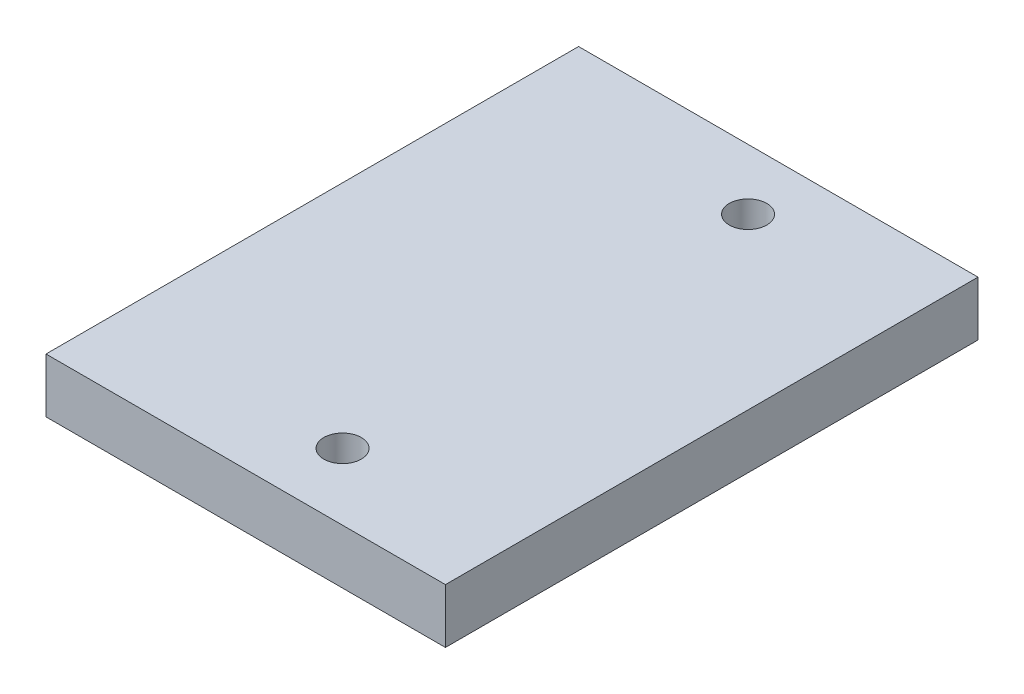
ISO-10303-21;
HEADER;
FILE_DESCRIPTION(('STEP AP214'),'2;1');
FILE_NAME('part.step','',(''),(''),'','','');
FILE_SCHEMA(('AUTOMOTIVE_DESIGN { 1 0 10303 214 1 1 1 1 }'));
ENDSEC;
DATA;
#1=APPLICATION_CONTEXT('core data for automotive mechanical design processes');
#2=APPLICATION_PROTOCOL_DEFINITION('international standard','automotive_design',2000,#1);
#3=PRODUCT_CONTEXT('',#1,'mechanical');
#4=PRODUCT('Part','Part','',(#3));
#5=PRODUCT_RELATED_PRODUCT_CATEGORY('part','',(#4));
#6=PRODUCT_DEFINITION_FORMATION('','',#4);
#7=PRODUCT_DEFINITION_CONTEXT('part definition',#1,'design');
#8=PRODUCT_DEFINITION('design','',#6,#7);
#9=PRODUCT_DEFINITION_SHAPE('','',#8);
#10=(LENGTH_UNIT() NAMED_UNIT(*) SI_UNIT(.MILLI.,.METRE.));
#11=(NAMED_UNIT(*) PLANE_ANGLE_UNIT() SI_UNIT($,.RADIAN.));
#12=(NAMED_UNIT(*) SI_UNIT($,.STERADIAN.) SOLID_ANGLE_UNIT());
#13=UNCERTAINTY_MEASURE_WITH_UNIT(LENGTH_MEASURE(1.E-05),#10,'distance_accuracy_value','');
#14=(GEOMETRIC_REPRESENTATION_CONTEXT(3) GLOBAL_UNCERTAINTY_ASSIGNED_CONTEXT((#13)) GLOBAL_UNIT_ASSIGNED_CONTEXT((#10,
#11,#12)) REPRESENTATION_CONTEXT('',''));
#15=CARTESIAN_POINT('',(0.,0.,0.));
#16=DIRECTION('',(0.,0.,1.));
#17=DIRECTION('',(1.,0.,0.));
#18=AXIS2_PLACEMENT_3D('',#15,#16,#17);
#19=CARTESIAN_POINT('',(0.,4.5,0.));
#20=DIRECTION('',(0.,-1.,0.));
#21=DIRECTION('',(0.,0.,-1.));
#22=AXIS2_PLACEMENT_3D('',#19,#20,#21);
#23=PLANE('',#22);
#24=CARTESIAN_POINT('',(19.,4.5,-5.50000000000001));
#25=DIRECTION('',(0.,1.,0.));
#26=DIRECTION('',(0.,0.,1.));
#27=AXIS2_PLACEMENT_3D('',#24,#25,#26);
#28=CIRCLE('',#27,1.55);
#29=CARTESIAN_POINT('',(19.,4.5,-3.95000000000001));
#30=VERTEX_POINT('',#29);
#31=EDGE_CURVE('E107',#30,#30,#28,.T.);
#32=ORIENTED_EDGE('',*,*,#31,.F.);
#33=EDGE_LOOP('',(#32));
#34=FACE_BOUND('',#33,.T.);
#35=CARTESIAN_POINT('',(19.,4.5,-39.));
#36=DIRECTION('',(0.,1.,0.));
#37=DIRECTION('',(0.,0.,1.));
#38=AXIS2_PLACEMENT_3D('',#35,#36,#37);
#39=CIRCLE('',#38,1.55);
#40=CARTESIAN_POINT('',(19.,4.5,-37.45));
#41=VERTEX_POINT('',#40);
#42=EDGE_CURVE('E96',#41,#41,#39,.T.);
#43=ORIENTED_EDGE('',*,*,#42,.F.);
#44=EDGE_LOOP('',(#43));
#45=FACE_BOUND('',#44,.T.);
#46=DIRECTION('',(1.,0.,0.));
#47=VECTOR('',#46,1.);
#48=CARTESIAN_POINT('',(0.,4.5,0.));
#49=LINE('',#48,#47);
#50=CARTESIAN_POINT('',(0.,4.5,0.));
#51=VERTEX_POINT('',#50);
#52=CARTESIAN_POINT('',(33.,4.5,0.));
#53=VERTEX_POINT('',#52);
#54=EDGE_CURVE('E100',#51,#53,#49,.T.);
#55=ORIENTED_EDGE('',*,*,#54,.T.);
#56=DIRECTION('',(0.,0.,1.));
#57=VECTOR('',#56,1.);
#58=CARTESIAN_POINT('',(33.,4.5,-44.));
#59=LINE('',#58,#57);
#60=CARTESIAN_POINT('',(33.,4.5,-44.));
#61=VERTEX_POINT('',#60);
#62=EDGE_CURVE('E113',#61,#53,#59,.T.);
#63=ORIENTED_EDGE('',*,*,#62,.F.);
#64=DIRECTION('',(-1.,0.,0.));
#65=VECTOR('',#64,1.);
#66=CARTESIAN_POINT('',(0.,4.5,-44.));
#67=LINE('',#66,#65);
#68=CARTESIAN_POINT('',(0.,4.5,-44.));
#69=VERTEX_POINT('',#68);
#70=EDGE_CURVE('E59',#61,#69,#67,.T.);
#71=ORIENTED_EDGE('',*,*,#70,.T.);
#72=DIRECTION('',(0.,0.,1.));
#73=VECTOR('',#72,1.);
#74=CARTESIAN_POINT('',(0.,4.5,0.));
#75=LINE('',#74,#73);
#76=EDGE_CURVE('E82',#69,#51,#75,.T.);
#77=ORIENTED_EDGE('',*,*,#76,.T.);
#78=EDGE_LOOP('',(#55,#63,#71,#77));
#79=FACE_BOUND('',#78,.T.);
#80=ADVANCED_FACE('F35',(#34,#45,#79),#23,.F.);
#81=CARTESIAN_POINT('',(0.,4.5,0.));
#82=DIRECTION('',(1.,0.,0.));
#83=DIRECTION('',(0.,0.,-1.));
#84=AXIS2_PLACEMENT_3D('',#81,#82,#83);
#85=PLANE('',#84);
#86=DIRECTION('',(0.,0.,1.));
#87=VECTOR('',#86,1.);
#88=CARTESIAN_POINT('',(0.,0.,0.));
#89=LINE('',#88,#87);
#90=CARTESIAN_POINT('',(0.,0.,-44.));
#91=VERTEX_POINT('',#90);
#92=CARTESIAN_POINT('',(0.,0.,0.));
#93=VERTEX_POINT('',#92);
#94=EDGE_CURVE('E88',#91,#93,#89,.T.);
#95=ORIENTED_EDGE('',*,*,#94,.T.);
#96=DIRECTION('',(0.,-1.,0.));
#97=VECTOR('',#96,1.);
#98=CARTESIAN_POINT('',(0.,4.5,0.));
#99=LINE('',#98,#97);
#100=EDGE_CURVE('E11',#51,#93,#99,.T.);
#101=ORIENTED_EDGE('',*,*,#100,.F.);
#102=ORIENTED_EDGE('',*,*,#76,.F.);
#103=DIRECTION('',(0.,-1.,0.));
#104=VECTOR('',#103,1.);
#105=CARTESIAN_POINT('',(0.,4.5,-44.));
#106=LINE('',#105,#104);
#107=EDGE_CURVE('E43',#69,#91,#106,.T.);
#108=ORIENTED_EDGE('',*,*,#107,.T.);
#109=EDGE_LOOP('',(#95,#101,#102,#108));
#110=FACE_BOUND('',#109,.T.);
#111=ADVANCED_FACE('F37',(#110),#85,.F.);
#112=CARTESIAN_POINT('',(0.,4.5,0.));
#113=DIRECTION('',(0.,0.,-1.));
#114=DIRECTION('',(-1.,0.,0.));
#115=AXIS2_PLACEMENT_3D('',#112,#113,#114);
#116=PLANE('',#115);
#117=DIRECTION('',(1.,0.,0.));
#118=VECTOR('',#117,1.);
#119=CARTESIAN_POINT('',(0.,0.,0.));
#120=LINE('',#119,#118);
#121=CARTESIAN_POINT('',(33.,0.,0.));
#122=VERTEX_POINT('',#121);
#123=EDGE_CURVE('E83',#93,#122,#120,.T.);
#124=ORIENTED_EDGE('',*,*,#123,.T.);
#125=DIRECTION('',(0.,1.,0.));
#126=VECTOR('',#125,1.);
#127=CARTESIAN_POINT('',(33.,3.5,0.));
#128=LINE('',#127,#126);
#129=EDGE_CURVE('E50',#122,#53,#128,.T.);
#130=ORIENTED_EDGE('',*,*,#129,.T.);
#131=ORIENTED_EDGE('',*,*,#54,.F.);
#132=ORIENTED_EDGE('',*,*,#100,.T.);
#133=EDGE_LOOP('',(#124,#130,#131,#132));
#134=FACE_BOUND('',#133,.T.);
#135=ADVANCED_FACE('F121',(#134),#116,.F.);
#136=CARTESIAN_POINT('',(0.,4.5,-44.));
#137=DIRECTION('',(0.,0.,1.));
#138=DIRECTION('',(1.,0.,0.));
#139=AXIS2_PLACEMENT_3D('',#136,#137,#138);
#140=PLANE('',#139);
#141=DIRECTION('',(0.,1.,0.));
#142=VECTOR('',#141,1.);
#143=CARTESIAN_POINT('',(33.,3.5,-44.));
#144=LINE('',#143,#142);
#145=CARTESIAN_POINT('',(33.,0.,-44.));
#146=VERTEX_POINT('',#145);
#147=EDGE_CURVE('E79',#146,#61,#144,.T.);
#148=ORIENTED_EDGE('',*,*,#147,.F.);
#149=DIRECTION('',(-1.,0.,0.));
#150=VECTOR('',#149,1.);
#151=CARTESIAN_POINT('',(0.,0.,-44.));
#152=LINE('',#151,#150);
#153=EDGE_CURVE('E73',#146,#91,#152,.T.);
#154=ORIENTED_EDGE('',*,*,#153,.T.);
#155=ORIENTED_EDGE('',*,*,#107,.F.);
#156=ORIENTED_EDGE('',*,*,#70,.F.);
#157=EDGE_LOOP('',(#148,#154,#155,#156));
#158=FACE_BOUND('',#157,.T.);
#159=ADVANCED_FACE('F75',(#158),#140,.F.);
#160=CARTESIAN_POINT('',(0.,0.,0.));
#161=DIRECTION('',(0.,-1.,0.));
#162=DIRECTION('',(0.,0.,-1.));
#163=AXIS2_PLACEMENT_3D('',#160,#161,#162);
#164=PLANE('',#163);
#165=DIRECTION('',(0.,0.,-1.));
#166=VECTOR('',#165,1.);
#167=CARTESIAN_POINT('',(33.,0.,-44.));
#168=LINE('',#167,#166);
#169=EDGE_CURVE('E116',#122,#146,#168,.T.);
#170=ORIENTED_EDGE('',*,*,#169,.F.);
#171=ORIENTED_EDGE('',*,*,#123,.F.);
#172=ORIENTED_EDGE('',*,*,#94,.F.);
#173=ORIENTED_EDGE('',*,*,#153,.F.);
#174=EDGE_LOOP('',(#170,#171,#172,#173));
#175=FACE_BOUND('',#174,.T.);
#176=CARTESIAN_POINT('',(19.,0.,-39.));
#177=DIRECTION('',(0.,-1.,0.));
#178=DIRECTION('',(0.,0.,-1.));
#179=AXIS2_PLACEMENT_3D('',#176,#177,#178);
#180=CIRCLE('',#179,1.55);
#181=CARTESIAN_POINT('',(19.,0.,-40.55));
#182=VERTEX_POINT('',#181);
#183=EDGE_CURVE('E92',#182,#182,#180,.F.);
#184=ORIENTED_EDGE('',*,*,#183,.T.);
#185=EDGE_LOOP('',(#184));
#186=FACE_BOUND('',#185,.T.);
#187=CARTESIAN_POINT('',(19.,0.,-5.50000000000001));
#188=DIRECTION('',(0.,-1.,0.));
#189=DIRECTION('',(0.,0.,-1.));
#190=AXIS2_PLACEMENT_3D('',#187,#188,#189);
#191=CIRCLE('',#190,1.55);
#192=CARTESIAN_POINT('',(19.,0.,-7.05));
#193=VERTEX_POINT('',#192);
#194=EDGE_CURVE('E104',#193,#193,#191,.F.);
#195=ORIENTED_EDGE('',*,*,#194,.T.);
#196=EDGE_LOOP('',(#195));
#197=FACE_BOUND('',#196,.T.);
#198=ADVANCED_FACE('F89',(#175,#186,#197),#164,.T.);
#199=CARTESIAN_POINT('',(19.,-4.38406204335659,-5.50000000000001));
#200=DIRECTION('',(0.,1.,0.));
#201=DIRECTION('',(0.,0.,1.));
#202=AXIS2_PLACEMENT_3D('',#199,#200,#201);
#203=CYLINDRICAL_SURFACE('',#202,1.55);
#204=ORIENTED_EDGE('',*,*,#31,.T.);
#205=EDGE_LOOP('',(#204));
#206=FACE_BOUND('',#205,.T.);
#207=ORIENTED_EDGE('',*,*,#194,.F.);
#208=EDGE_LOOP('',(#207));
#209=FACE_BOUND('',#208,.T.);
#210=ADVANCED_FACE('F132',(#206,#209),#203,.F.);
#211=CARTESIAN_POINT('',(19.,-4.38406204335659,-39.));
#212=DIRECTION('',(0.,1.,0.));
#213=DIRECTION('',(0.,0.,1.));
#214=AXIS2_PLACEMENT_3D('',#211,#212,#213);
#215=CYLINDRICAL_SURFACE('',#214,1.55);
#216=ORIENTED_EDGE('',*,*,#42,.T.);
#217=EDGE_LOOP('',(#216));
#218=FACE_BOUND('',#217,.T.);
#219=ORIENTED_EDGE('',*,*,#183,.F.);
#220=EDGE_LOOP('',(#219));
#221=FACE_BOUND('',#220,.T.);
#222=ADVANCED_FACE('F157',(#218,#221),#215,.F.);
#223=CARTESIAN_POINT('',(33.,3.5,-44.));
#224=DIRECTION('',(-1.,0.,0.));
#225=DIRECTION('',(0.,0.,1.));
#226=AXIS2_PLACEMENT_3D('',#223,#224,#225);
#227=PLANE('',#226);
#228=ORIENTED_EDGE('',*,*,#62,.T.);
#229=ORIENTED_EDGE('',*,*,#129,.F.);
#230=ORIENTED_EDGE('',*,*,#169,.T.);
#231=ORIENTED_EDGE('',*,*,#147,.T.);
#232=EDGE_LOOP('',(#228,#229,#230,#231));
#233=FACE_BOUND('',#232,.T.);
#234=ADVANCED_FACE('F117',(#233),#227,.F.);
#235=CLOSED_SHELL('',(#80,#111,#135,#159,#198,#210,#222,#234));
#236=MANIFOLD_SOLID_BREP('B2',#235);
#237=ADVANCED_BREP_SHAPE_REPRESENTATION('',(#18,#236),#14);
#238=SHAPE_DEFINITION_REPRESENTATION(#9,#237);
ENDSEC;
END-ISO-10303-21;
